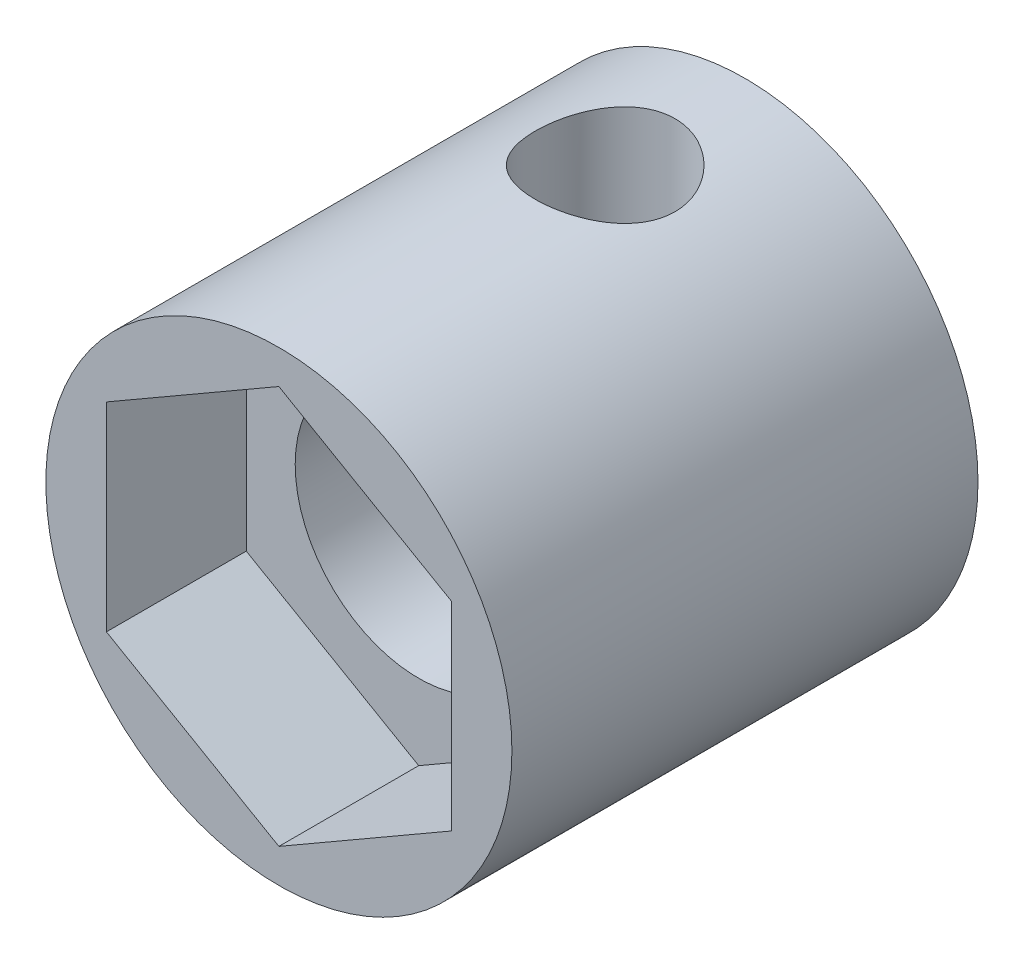
ISO-10303-21;
HEADER;
FILE_DESCRIPTION(('STEP AP214'),'2;1');
FILE_NAME('part.step','',(''),(''),'','','');
FILE_SCHEMA(('AUTOMOTIVE_DESIGN { 1 0 10303 214 1 1 1 1 }'));
ENDSEC;
DATA;
#1=APPLICATION_CONTEXT('core data for automotive mechanical design processes');
#2=APPLICATION_PROTOCOL_DEFINITION('international standard','automotive_design',2000,#1);
#3=PRODUCT_CONTEXT('',#1,'mechanical');
#4=PRODUCT('Part','Part','',(#3));
#5=PRODUCT_RELATED_PRODUCT_CATEGORY('part','',(#4));
#6=PRODUCT_DEFINITION_FORMATION('','',#4);
#7=PRODUCT_DEFINITION_CONTEXT('part definition',#1,'design');
#8=PRODUCT_DEFINITION('design','',#6,#7);
#9=PRODUCT_DEFINITION_SHAPE('','',#8);
#10=(LENGTH_UNIT() NAMED_UNIT(*) SI_UNIT(.MILLI.,.METRE.));
#11=(NAMED_UNIT(*) PLANE_ANGLE_UNIT() SI_UNIT($,.RADIAN.));
#12=(NAMED_UNIT(*) SI_UNIT($,.STERADIAN.) SOLID_ANGLE_UNIT());
#13=UNCERTAINTY_MEASURE_WITH_UNIT(LENGTH_MEASURE(1.E-05),#10,'distance_accuracy_value','');
#14=(GEOMETRIC_REPRESENTATION_CONTEXT(3) GLOBAL_UNCERTAINTY_ASSIGNED_CONTEXT((#13)) GLOBAL_UNIT_ASSIGNED_CONTEXT((#10,
#11,#12)) REPRESENTATION_CONTEXT('',''));
#15=CARTESIAN_POINT('',(0.,0.,0.));
#16=DIRECTION('',(0.,0.,1.));
#17=DIRECTION('',(1.,0.,0.));
#18=AXIS2_PLACEMENT_3D('',#15,#16,#17);
#19=CARTESIAN_POINT('',(0.,0.,10.));
#20=DIRECTION('',(0.,0.,-1.));
#21=DIRECTION('',(-1.,0.,0.));
#22=AXIS2_PLACEMENT_3D('',#19,#20,#21);
#23=CYLINDRICAL_SURFACE('',#22,5.);
#24=CARTESIAN_POINT('',(0.,-5.,4.5));
#25=CARTESIAN_POINT('',(0.0822886127533003,-4.9999992925055,4.49999900251511));
#26=CARTESIAN_POINT('',(0.16458731835153,-4.99794915693954,4.49320613637603));
#27=CARTESIAN_POINT('',(0.326788125304881,-4.98997105593691,4.4662786457779));
#28=CARTESIAN_POINT('',(0.40668950441142,-4.98404193389692,4.44614004197666));
#29=CARTESIAN_POINT('',(0.561732707754527,-4.96895552501836,4.39325398308974));
#30=CARTESIAN_POINT('',(0.636881364395373,-4.95980300250425,4.36052513038106));
#31=CARTESIAN_POINT('',(0.780624181053132,-4.93922109237645,4.28346390694416));
#32=CARTESIAN_POINT('',(0.84921746746967,-4.92779140192067,4.23912999260458));
#33=CARTESIAN_POINT('',(0.979871797183746,-4.90350737192774,4.13877599252733));
#34=CARTESIAN_POINT('',(1.04171807124434,-4.89062383657036,4.08248337411409));
#35=CARTESIAN_POINT('',(1.15524920923324,-4.86505834210442,3.96039077008981));
#36=CARTESIAN_POINT('',(1.20693236327441,-4.85237641724501,3.89458918787504));
#37=CARTESIAN_POINT('',(1.29980037723708,-4.82834113993772,3.75352924696239));
#38=CARTESIAN_POINT('',(1.34072309022214,-4.81702406663875,3.67809153900926));
#39=CARTESIAN_POINT('',(1.4092139477476,-4.79743620394031,3.52101074576971));
#40=CARTESIAN_POINT('',(1.43678529919973,-4.78916468313311,3.43936915607202));
#41=CARTESIAN_POINT('',(1.47701633682652,-4.77690870838434,3.27460973386954));
#42=CARTESIAN_POINT('',(1.49007196234677,-4.77281069324533,3.19159725613606));
#43=CARTESIAN_POINT('',(1.50213730614672,-4.76902789749767,3.02446684378323));
#44=CARTESIAN_POINT('',(1.50115042761078,-4.76934204760571,2.94034918194091));
#45=CARTESIAN_POINT('',(1.48546977199812,-4.77424744067778,2.77661609139151));
#46=CARTESIAN_POINT('',(1.47127205262685,-4.7786838859914,2.69694774963776));
#47=CARTESIAN_POINT('',(1.43037420427056,-4.79108356228624,2.54118021372654));
#48=CARTESIAN_POINT('',(1.40367284141641,-4.79904714132351,2.46508137262567));
#49=CARTESIAN_POINT('',(1.33816026653682,-4.81772733074973,2.31739965033926));
#50=CARTESIAN_POINT('',(1.29918816934642,-4.82848016115952,2.24589291604474));
#51=CARTESIAN_POINT('',(1.21035222588683,-4.85150987000065,2.11026797798981));
#52=CARTESIAN_POINT('',(1.16048574002588,-4.86378711746991,2.04615157058622));
#53=CARTESIAN_POINT('',(1.04881290765546,-4.88911011297937,1.92431380923798));
#54=CARTESIAN_POINT('',(0.986594907466972,-4.90216654310498,1.86697133597033));
#55=CARTESIAN_POINT('',(0.853263259313966,-4.92712244063259,1.76344601593575));
#56=CARTESIAN_POINT('',(0.782149051860887,-4.9390218351841,1.71726387158557));
#57=CARTESIAN_POINT('',(0.632355038342802,-4.9604316006947,1.63714007753527));
#58=CARTESIAN_POINT('',(0.553627749747949,-4.96992543668314,1.60328248375014));
#59=CARTESIAN_POINT('',(0.391245415603518,-4.98533521832222,1.54940040990037));
#60=CARTESIAN_POINT('',(0.307591751589581,-4.99125216186999,1.52937207146751));
#61=CARTESIAN_POINT('',(0.140952242668331,-4.99868364643538,1.50434782210061));
#62=CARTESIAN_POINT('',(0.058050097601186,-5.0003485041779,1.49883841419839));
#63=CARTESIAN_POINT('',(-0.107499605823384,-4.9995292324176,1.50156915571208));
#64=CARTESIAN_POINT('',(-0.190147196690782,-4.99704565677756,1.50980746965144));
#65=CARTESIAN_POINT('',(-0.350903605309698,-4.98830696987163,1.5393846111115));
#66=CARTESIAN_POINT('',(-0.42907277261417,-4.98213829799417,1.56042338758087));
#67=CARTESIAN_POINT('',(-0.580754638954522,-4.96674347841533,1.6146432327782));
#68=CARTESIAN_POINT('',(-0.654266777025584,-4.95751696321085,1.64782576103786));
#69=CARTESIAN_POINT('',(-0.796437189461053,-4.93669654351325,1.72625316548113));
#70=CARTESIAN_POINT('',(-0.86494382619967,-4.92505280829675,1.77175934094797));
#71=CARTESIAN_POINT('',(-0.993523307980148,-4.90073468764318,1.87322475405281));
#72=CARTESIAN_POINT('',(-1.05359403235594,-4.8880600443108,1.92918661188767));
#73=CARTESIAN_POINT('',(-1.16585744551027,-4.86253171869138,2.05238730836935));
#74=CARTESIAN_POINT('',(-1.21768481231504,-4.84968825033268,2.11996187577174));
#75=CARTESIAN_POINT('',(-1.30928995072154,-4.82576515238463,2.26312793901353));
#76=CARTESIAN_POINT('',(-1.34906803829472,-4.81468547654651,2.33871922455822));
#77=CARTESIAN_POINT('',(-1.41517347127168,-4.79567189615055,2.49553249125469));
#78=CARTESIAN_POINT('',(-1.4415634693705,-4.78772337843827,2.57672618653659));
#79=CARTESIAN_POINT('',(-1.48021730815114,-4.77591594362794,2.74268796893148));
#80=CARTESIAN_POINT('',(-1.49248598978779,-4.772055625083,2.82745482078767));
#81=CARTESIAN_POINT('',(-1.50221984485059,-4.76899972496087,2.99436151837623));
#82=CARTESIAN_POINT('',(-1.5002805530849,-4.76961647442755,3.07646365101759));
#83=CARTESIAN_POINT('',(-1.48307505444813,-4.77499401288294,3.2391141033728));
#84=CARTESIAN_POINT('',(-1.46780938124716,-4.77975463592551,3.31966248517635));
#85=CARTESIAN_POINT('',(-1.42476888804136,-4.79275763670386,3.47594539914285));
#86=CARTESIAN_POINT('',(-1.39715175507068,-4.80095604545965,3.55172728736169));
#87=CARTESIAN_POINT('',(-1.33031507121129,-4.81990278909136,3.69764243881772));
#88=CARTESIAN_POINT('',(-1.29109329962876,-4.83065161194312,3.76777461764076));
#89=CARTESIAN_POINT('',(-1.20048763805072,-4.85397676425833,3.90316311652711));
#90=CARTESIAN_POINT('',(-1.14871276092994,-4.86660540163798,3.96814876126041));
#91=CARTESIAN_POINT('',(-1.03517434629782,-4.89201320450026,4.08870249830786));
#92=CARTESIAN_POINT('',(-0.9734082171345,-4.90479240823905,4.14426813946776));
#93=CARTESIAN_POINT('',(-0.839465762183247,-4.92950936570649,4.24602341229503));
#94=CARTESIAN_POINT('',(-0.767037885790607,-4.94141159765674,4.29189144685549));
#95=CARTESIAN_POINT('',(-0.615141373983528,-4.96260680455813,4.37073516990403));
#96=CARTESIAN_POINT('',(-0.535676052998953,-4.97190099931067,4.40371688827451));
#97=CARTESIAN_POINT('',(-0.38075771265528,-4.98602174969301,4.45289527565275));
#98=CARTESIAN_POINT('',(-0.305786961954233,-4.99122027381068,4.47051167288325));
#99=CARTESIAN_POINT('',(-0.153880195230779,-4.99820944494492,4.49406352524158));
#100=CARTESIAN_POINT('',(-0.0769445098581392,-5.0000006615474,4.50000093270482));
#101=CARTESIAN_POINT('',(0.,-5.,4.5));
#102=B_SPLINE_CURVE_WITH_KNOTS('',3,(#24,#25,#26,#27,#28,#29,#30,#31,#32,#33,#34,#35,#36,#37,
#38,#39,#40,#41,#42,#43,#44,#45,#46,#47,#48,#49,#50,#51,#52,#53,#54,#55,#56,#57,#58,#59,#60,#61,
#62,#63,#64,#65,#66,#67,#68,#69,#70,#71,#72,#73,#74,#75,#76,#77,#78,#79,#80,#81,#82,#83,#84,#85,
#86,#87,#88,#89,#90,#91,#92,#93,#94,#95,#96,#97,#98,#99,#100,#101),.UNSPECIFIED.,.T.,.F.,(4,2,2,
2,2,2,2,2,2,2,2,2,2,2,2,2,2,2,2,2,2,2,2,2,2,2,2,2,2,2,2,2,2,2,2,2,2,2,4),(0.,0.246583203612611,
0.493239964846,0.739533676300874,0.985860164412702,1.23855602948192,1.49129437288633,
1.74971481004109,2.00807314543224,2.25919689356599,2.51025978319089,2.75226016697676,
2.99428443658001,3.2396242644712,3.48502360158555,3.74067104048167,3.99633456531071,
4.25371046881689,4.51101453528808,4.75908809438545,5.00712853550327,5.24956746682327,
5.49203554593729,5.74011305702908,5.98825282000191,6.24540400322818,6.5025484425268,
6.75847814951252,7.01432009460283,7.25950155466943,7.504673196616,7.74680040402721,
7.98897397553107,8.23996925679931,8.49102974897502,8.7494299615667,9.00770911595235,
9.23831691930459,9.46888616948874),.UNSPECIFIED.);
#103=CARTESIAN_POINT('',(0.,-5.,4.5));
#104=VERTEX_POINT('',#103);
#105=EDGE_CURVE('E199',#104,#104,#102,.T.);
#106=ORIENTED_EDGE('',*,*,#105,.T.);
#107=EDGE_LOOP('',(#106));
#108=FACE_BOUND('',#107,.T.);
#109=CARTESIAN_POINT('',(0.,5.,4.5));
#110=CARTESIAN_POINT('',(-0.0822886127532999,4.9999992925055,4.49999900251511));
#111=CARTESIAN_POINT('',(-0.164587318351529,4.99794915693954,4.49320613637603));
#112=CARTESIAN_POINT('',(-0.32678812530488,4.98997105593691,4.4662786457779));
#113=CARTESIAN_POINT('',(-0.406689504411419,4.98404193389692,4.44614004197666));
#114=CARTESIAN_POINT('',(-0.561732707754526,4.96895552501836,4.39325398308974));
#115=CARTESIAN_POINT('',(-0.636881364395372,4.95980300250425,4.36052513038106));
#116=CARTESIAN_POINT('',(-0.780624181053131,4.93922109237645,4.28346390694416));
#117=CARTESIAN_POINT('',(-0.849217467469668,4.92779140192067,4.23912999260458));
#118=CARTESIAN_POINT('',(-0.979871797183744,4.90350737192774,4.13877599252733));
#119=CARTESIAN_POINT('',(-1.04171807124434,4.89062383657036,4.08248337411409));
#120=CARTESIAN_POINT('',(-1.15524920923324,4.86505834210442,3.96039077008982));
#121=CARTESIAN_POINT('',(-1.20693236327441,4.85237641724501,3.89458918787504));
#122=CARTESIAN_POINT('',(-1.29980037723708,4.82834113993772,3.75352924696239));
#123=CARTESIAN_POINT('',(-1.34072309022213,4.81702406663875,3.67809153900926));
#124=CARTESIAN_POINT('',(-1.4092139477476,4.79743620394031,3.52101074576971));
#125=CARTESIAN_POINT('',(-1.43678529919973,4.78916468313311,3.43936915607202));
#126=CARTESIAN_POINT('',(-1.47701633682652,4.77690870838434,3.27460973386954));
#127=CARTESIAN_POINT('',(-1.49007196234677,4.77281069324533,3.19159725613606));
#128=CARTESIAN_POINT('',(-1.50213730614672,4.76902789749767,3.02446684378323));
#129=CARTESIAN_POINT('',(-1.50115042761078,4.76934204760571,2.94034918194091));
#130=CARTESIAN_POINT('',(-1.48546977199812,4.77424744067778,2.77661609139152));
#131=CARTESIAN_POINT('',(-1.47127205262685,4.77868388599141,2.69694774963776));
#132=CARTESIAN_POINT('',(-1.43037420427056,4.79108356228624,2.54118021372654));
#133=CARTESIAN_POINT('',(-1.40367284141641,4.79904714132351,2.46508137262567));
#134=CARTESIAN_POINT('',(-1.33816026653682,4.81772733074973,2.31739965033926));
#135=CARTESIAN_POINT('',(-1.29918816934642,4.82848016115952,2.24589291604474));
#136=CARTESIAN_POINT('',(-1.21035222588683,4.85150987000065,2.11026797798981));
#137=CARTESIAN_POINT('',(-1.16048574002588,4.86378711746991,2.04615157058622));
#138=CARTESIAN_POINT('',(-1.04881290765546,4.88911011297937,1.92431380923798));
#139=CARTESIAN_POINT('',(-0.986594907466971,4.90216654310498,1.86697133597033));
#140=CARTESIAN_POINT('',(-0.853263259313966,4.92712244063259,1.76344601593575));
#141=CARTESIAN_POINT('',(-0.782149051860887,4.9390218351841,1.71726387158557));
#142=CARTESIAN_POINT('',(-0.632355038342803,4.9604316006947,1.63714007753527));
#143=CARTESIAN_POINT('',(-0.55362774974795,4.96992543668314,1.60328248375014));
#144=CARTESIAN_POINT('',(-0.391245415603519,4.98533521832222,1.54940040990037));
#145=CARTESIAN_POINT('',(-0.307591751589582,4.99125216186999,1.52937207146751));
#146=CARTESIAN_POINT('',(-0.140952242668332,4.99868364643538,1.50434782210061));
#147=CARTESIAN_POINT('',(-0.0580500976011871,5.0003485041779,1.49883841419839));
#148=CARTESIAN_POINT('',(0.107499605823383,4.9995292324176,1.50156915571208));
#149=CARTESIAN_POINT('',(0.190147196690781,4.99704565677756,1.50980746965144));
#150=CARTESIAN_POINT('',(0.350903605309697,4.98830696987163,1.5393846111115));
#151=CARTESIAN_POINT('',(0.429072772614169,4.98213829799417,1.56042338758087));
#152=CARTESIAN_POINT('',(0.580754638954522,4.96674347841533,1.6146432327782));
#153=CARTESIAN_POINT('',(0.654266777025584,4.95751696321085,1.64782576103786));
#154=CARTESIAN_POINT('',(0.796437189461053,4.93669654351325,1.72625316548113));
#155=CARTESIAN_POINT('',(0.86494382619967,4.92505280829675,1.77175934094797));
#156=CARTESIAN_POINT('',(0.993523307980147,4.90073468764318,1.87322475405281));
#157=CARTESIAN_POINT('',(1.05359403235593,4.8880600443108,1.92918661188767));
#158=CARTESIAN_POINT('',(1.16585744551027,4.86253171869138,2.05238730836935));
#159=CARTESIAN_POINT('',(1.21768481231504,4.84968825033268,2.11996187577174));
#160=CARTESIAN_POINT('',(1.30928995072154,4.82576515238463,2.26312793901353));
#161=CARTESIAN_POINT('',(1.34906803829472,4.81468547654651,2.33871922455821));
#162=CARTESIAN_POINT('',(1.41517347127168,4.79567189615055,2.49553249125469));
#163=CARTESIAN_POINT('',(1.4415634693705,4.78772337843827,2.57672618653659));
#164=CARTESIAN_POINT('',(1.48021730815114,4.77591594362794,2.74268796893148));
#165=CARTESIAN_POINT('',(1.49248598978779,4.772055625083,2.82745482078767));
#166=CARTESIAN_POINT('',(1.50221984485059,4.76899972496087,2.99436151837623));
#167=CARTESIAN_POINT('',(1.5002805530849,4.76961647442754,3.07646365101759));
#168=CARTESIAN_POINT('',(1.48307505444813,4.77499401288294,3.2391141033728));
#169=CARTESIAN_POINT('',(1.46780938124716,4.77975463592551,3.31966248517635));
#170=CARTESIAN_POINT('',(1.42476888804136,4.79275763670385,3.47594539914285));
#171=CARTESIAN_POINT('',(1.39715175507068,4.80095604545965,3.55172728736169));
#172=CARTESIAN_POINT('',(1.33031507121129,4.81990278909136,3.69764243881772));
#173=CARTESIAN_POINT('',(1.29109329962876,4.83065161194312,3.76777461764076));
#174=CARTESIAN_POINT('',(1.20048763805072,4.85397676425833,3.90316311652711));
#175=CARTESIAN_POINT('',(1.14871276092994,4.86660540163798,3.96814876126041));
#176=CARTESIAN_POINT('',(1.03517434629782,4.89201320450026,4.08870249830786));
#177=CARTESIAN_POINT('',(0.973408217134502,4.90479240823905,4.14426813946776));
#178=CARTESIAN_POINT('',(0.839465762183249,4.92950936570649,4.24602341229503));
#179=CARTESIAN_POINT('',(0.767037885790608,4.94141159765674,4.29189144685549));
#180=CARTESIAN_POINT('',(0.61514137398353,4.96260680455813,4.37073516990402));
#181=CARTESIAN_POINT('',(0.535676052998956,4.97190099931067,4.40371688827451));
#182=CARTESIAN_POINT('',(0.380757712655282,4.98602174969301,4.45289527565275));
#183=CARTESIAN_POINT('',(0.305786961954235,4.99122027381068,4.47051167288325));
#184=CARTESIAN_POINT('',(0.15388019523078,4.99820944494492,4.49406352524158));
#185=CARTESIAN_POINT('',(0.0769445098581397,5.0000006615474,4.50000093270482));
#186=CARTESIAN_POINT('',(0.,5.,4.5));
#187=B_SPLINE_CURVE_WITH_KNOTS('',3,(#109,#110,#111,#112,#113,#114,#115,#116,#117,#118,#119,
#120,#121,#122,#123,#124,#125,#126,#127,#128,#129,#130,#131,#132,#133,#134,#135,#136,#137,#138,
#139,#140,#141,#142,#143,#144,#145,#146,#147,#148,#149,#150,#151,#152,#153,#154,#155,#156,#157,
#158,#159,#160,#161,#162,#163,#164,#165,#166,#167,#168,#169,#170,#171,#172,#173,#174,#175,#176,
#177,#178,#179,#180,#181,#182,#183,#184,#185,#186),.UNSPECIFIED.,.T.,.F.,(4,2,2,2,2,2,2,2,2,2,2,
2,2,2,2,2,2,2,2,2,2,2,2,2,2,2,2,2,2,2,2,2,2,2,2,2,2,2,4),(0.,0.24658320361261,0.493239964845999,
0.739533676300873,0.985860164412701,1.23855602948191,1.49129437288633,1.74971481004109,
2.00807314543223,2.25919689356599,2.51025978319089,2.75226016697676,2.99428443658001,
3.23962426447119,3.48502360158555,3.74067104048167,3.99633456531071,4.25371046881688,
4.51101453528807,4.75908809438545,5.00712853550327,5.24956746682327,5.49203554593728,
5.74011305702908,5.98825282000191,6.24540400322818,6.5025484425268,6.75847814951251,
7.01432009460283,7.25950155466942,7.50467319661599,7.74680040402721,7.98897397553107,
8.2399692567993,8.49102974897502,8.7494299615667,9.00770911595235,9.23831691930459,
9.46888616948874),.UNSPECIFIED.);
#188=CARTESIAN_POINT('',(0.,5.,4.5));
#189=VERTEX_POINT('',#188);
#190=EDGE_CURVE('E193',#189,#189,#187,.T.);
#191=ORIENTED_EDGE('',*,*,#190,.T.);
#192=EDGE_LOOP('',(#191));
#193=FACE_BOUND('',#192,.T.);
#194=CARTESIAN_POINT('',(0.,0.,10.));
#195=DIRECTION('',(0.,0.,1.));
#196=DIRECTION('',(1.,0.,0.));
#197=AXIS2_PLACEMENT_3D('',#194,#195,#196);
#198=CIRCLE('',#197,5.);
#199=CARTESIAN_POINT('',(5.,0.,10.));
#200=VERTEX_POINT('',#199);
#201=EDGE_CURVE('E11',#200,#200,#198,.T.);
#202=ORIENTED_EDGE('',*,*,#201,.F.);
#203=EDGE_LOOP('',(#202));
#204=FACE_BOUND('',#203,.T.);
#205=CARTESIAN_POINT('',(0.,0.,0.));
#206=DIRECTION('',(0.,0.,1.));
#207=DIRECTION('',(1.,0.,0.));
#208=AXIS2_PLACEMENT_3D('',#205,#206,#207);
#209=CIRCLE('',#208,5.);
#210=CARTESIAN_POINT('',(5.,0.,0.));
#211=VERTEX_POINT('',#210);
#212=EDGE_CURVE('E48',#211,#211,#209,.T.);
#213=ORIENTED_EDGE('',*,*,#212,.T.);
#214=EDGE_LOOP('',(#213));
#215=FACE_BOUND('',#214,.T.);
#216=ADVANCED_FACE('F38',(#108,#193,#204,#215),#23,.T.);
#217=CARTESIAN_POINT('',(0.,0.,10.));
#218=DIRECTION('',(0.,0.,1.));
#219=DIRECTION('',(1.,0.,0.));
#220=AXIS2_PLACEMENT_3D('',#217,#218,#219);
#221=PLANE('',#220);
#222=DIRECTION('',(0.866025403784439,0.5,0.));
#223=VECTOR('',#222,1.);
#224=CARTESIAN_POINT('',(0.,-4.27239199200323,10.));
#225=LINE('',#224,#223);
#226=CARTESIAN_POINT('',(0.,-4.27239199200323,10.));
#227=VERTEX_POINT('',#226);
#228=CARTESIAN_POINT('',(3.7,-2.13619599600162,10.));
#229=VERTEX_POINT('',#228);
#230=EDGE_CURVE('E56',#227,#229,#225,.T.);
#231=ORIENTED_EDGE('',*,*,#230,.F.);
#232=DIRECTION('',(0.866025403784439,-0.5,0.));
#233=VECTOR('',#232,1.);
#234=CARTESIAN_POINT('',(-3.7,-2.13619599600162,10.));
#235=LINE('',#234,#233);
#236=CARTESIAN_POINT('',(-3.7,-2.13619599600162,10.));
#237=VERTEX_POINT('',#236);
#238=EDGE_CURVE('E150',#237,#227,#235,.T.);
#239=ORIENTED_EDGE('',*,*,#238,.F.);
#240=DIRECTION('',(0.,-1.,0.));
#241=VECTOR('',#240,1.);
#242=CARTESIAN_POINT('',(-3.7,2.13619599600161,10.));
#243=LINE('',#242,#241);
#244=CARTESIAN_POINT('',(-3.7,2.13619599600161,10.));
#245=VERTEX_POINT('',#244);
#246=EDGE_CURVE('E147',#245,#237,#243,.T.);
#247=ORIENTED_EDGE('',*,*,#246,.F.);
#248=DIRECTION('',(-0.866025403784439,-0.5,0.));
#249=VECTOR('',#248,1.);
#250=CARTESIAN_POINT('',(0.,4.27239199200323,10.));
#251=LINE('',#250,#249);
#252=CARTESIAN_POINT('',(0.,4.27239199200323,10.));
#253=VERTEX_POINT('',#252);
#254=EDGE_CURVE('E104',#253,#245,#251,.T.);
#255=ORIENTED_EDGE('',*,*,#254,.F.);
#256=DIRECTION('',(-0.866025403784439,0.5,0.));
#257=VECTOR('',#256,1.);
#258=CARTESIAN_POINT('',(3.7,2.13619599600161,10.));
#259=LINE('',#258,#257);
#260=CARTESIAN_POINT('',(3.7,2.13619599600161,10.));
#261=VERTEX_POINT('',#260);
#262=EDGE_CURVE('E141',#261,#253,#259,.T.);
#263=ORIENTED_EDGE('',*,*,#262,.F.);
#264=DIRECTION('',(0.,1.,0.));
#265=VECTOR('',#264,1.);
#266=CARTESIAN_POINT('',(3.7,-2.13619599600162,10.));
#267=LINE('',#266,#265);
#268=EDGE_CURVE('E136',#229,#261,#267,.T.);
#269=ORIENTED_EDGE('',*,*,#268,.F.);
#270=EDGE_LOOP('',(#231,#239,#247,#255,#263,#269));
#271=FACE_BOUND('',#270,.T.);
#272=ORIENTED_EDGE('',*,*,#201,.T.);
#273=EDGE_LOOP('',(#272));
#274=FACE_BOUND('',#273,.T.);
#275=ADVANCED_FACE('F218',(#271,#274),#221,.T.);
#276=CARTESIAN_POINT('',(0.,0.,0.));
#277=DIRECTION('',(0.,0.,1.));
#278=DIRECTION('',(1.,0.,0.));
#279=AXIS2_PLACEMENT_3D('',#276,#277,#278);
#280=PLANE('',#279);
#281=CARTESIAN_POINT('',(0.,0.,0.));
#282=DIRECTION('',(0.,0.,-1.));
#283=DIRECTION('',(-1.,0.,0.));
#284=AXIS2_PLACEMENT_3D('',#281,#282,#283);
#285=CIRCLE('',#284,2.65);
#286=CARTESIAN_POINT('',(-2.65,0.,0.));
#287=VERTEX_POINT('',#286);
#288=EDGE_CURVE('E137',#287,#287,#285,.T.);
#289=ORIENTED_EDGE('',*,*,#288,.F.);
#290=EDGE_LOOP('',(#289));
#291=FACE_BOUND('',#290,.T.);
#292=ORIENTED_EDGE('',*,*,#212,.F.);
#293=EDGE_LOOP('',(#292));
#294=FACE_BOUND('',#293,.T.);
#295=ADVANCED_FACE('F230',(#291,#294),#280,.F.);
#296=CARTESIAN_POINT('',(0.,-4.27239199200323,7.));
#297=DIRECTION('',(0.5,-0.866025403784439,0.));
#298=DIRECTION('',(0.866025403784439,0.5,0.));
#299=AXIS2_PLACEMENT_3D('',#296,#297,#298);
#300=PLANE('',#299);
#301=ORIENTED_EDGE('',*,*,#230,.T.);
#302=DIRECTION('',(0.,0.,1.));
#303=VECTOR('',#302,1.);
#304=CARTESIAN_POINT('',(3.7,-2.13619599600162,7.));
#305=LINE('',#304,#303);
#306=CARTESIAN_POINT('',(3.7,-2.13619599600162,7.));
#307=VERTEX_POINT('',#306);
#308=EDGE_CURVE('E86',#307,#229,#305,.T.);
#309=ORIENTED_EDGE('',*,*,#308,.F.);
#310=DIRECTION('',(0.866025403784439,0.5,0.));
#311=VECTOR('',#310,1.);
#312=CARTESIAN_POINT('',(0.,-4.27239199200323,7.));
#313=LINE('',#312,#311);
#314=CARTESIAN_POINT('',(0.,-4.27239199200323,7.));
#315=VERTEX_POINT('',#314);
#316=EDGE_CURVE('E153',#315,#307,#313,.T.);
#317=ORIENTED_EDGE('',*,*,#316,.F.);
#318=DIRECTION('',(0.,0.,1.));
#319=VECTOR('',#318,1.);
#320=CARTESIAN_POINT('',(0.,-4.27239199200323,7.));
#321=LINE('',#320,#319);
#322=EDGE_CURVE('E64',#315,#227,#321,.T.);
#323=ORIENTED_EDGE('',*,*,#322,.T.);
#324=EDGE_LOOP('',(#301,#309,#317,#323));
#325=FACE_BOUND('',#324,.T.);
#326=ADVANCED_FACE('F223',(#325),#300,.F.);
#327=CARTESIAN_POINT('',(-3.7,-2.13619599600162,7.));
#328=DIRECTION('',(-0.5,-0.866025403784439,0.));
#329=DIRECTION('',(0.866025403784439,-0.5,0.));
#330=AXIS2_PLACEMENT_3D('',#327,#328,#329);
#331=PLANE('',#330);
#332=ORIENTED_EDGE('',*,*,#238,.T.);
#333=ORIENTED_EDGE('',*,*,#322,.F.);
#334=DIRECTION('',(0.866025403784439,-0.5,0.));
#335=VECTOR('',#334,1.);
#336=CARTESIAN_POINT('',(-3.7,-2.13619599600162,7.));
#337=LINE('',#336,#335);
#338=CARTESIAN_POINT('',(-3.7,-2.13619599600162,7.));
#339=VERTEX_POINT('',#338);
#340=EDGE_CURVE('E118',#339,#315,#337,.T.);
#341=ORIENTED_EDGE('',*,*,#340,.F.);
#342=DIRECTION('',(0.,0.,1.));
#343=VECTOR('',#342,1.);
#344=CARTESIAN_POINT('',(-3.7,-2.13619599600162,7.));
#345=LINE('',#344,#343);
#346=EDGE_CURVE('E109',#339,#237,#345,.T.);
#347=ORIENTED_EDGE('',*,*,#346,.T.);
#348=EDGE_LOOP('',(#332,#333,#341,#347));
#349=FACE_BOUND('',#348,.T.);
#350=ADVANCED_FACE('F221',(#349),#331,.F.);
#351=CARTESIAN_POINT('',(-3.7,2.13619599600161,7.));
#352=DIRECTION('',(-1.,0.,0.));
#353=DIRECTION('',(0.,0.,1.));
#354=AXIS2_PLACEMENT_3D('',#351,#352,#353);
#355=PLANE('',#354);
#356=ORIENTED_EDGE('',*,*,#246,.T.);
#357=ORIENTED_EDGE('',*,*,#346,.F.);
#358=DIRECTION('',(0.,-1.,0.));
#359=VECTOR('',#358,1.);
#360=CARTESIAN_POINT('',(-3.7,2.13619599600161,7.));
#361=LINE('',#360,#359);
#362=CARTESIAN_POINT('',(-3.7,2.13619599600161,7.));
#363=VERTEX_POINT('',#362);
#364=EDGE_CURVE('E113',#363,#339,#361,.T.);
#365=ORIENTED_EDGE('',*,*,#364,.F.);
#366=DIRECTION('',(0.,0.,1.));
#367=VECTOR('',#366,1.);
#368=CARTESIAN_POINT('',(-3.7,2.13619599600161,7.));
#369=LINE('',#368,#367);
#370=EDGE_CURVE('E97',#363,#245,#369,.T.);
#371=ORIENTED_EDGE('',*,*,#370,.T.);
#372=EDGE_LOOP('',(#356,#357,#365,#371));
#373=FACE_BOUND('',#372,.T.);
#374=ADVANCED_FACE('F114',(#373),#355,.F.);
#375=CARTESIAN_POINT('',(0.,4.27239199200323,7.));
#376=DIRECTION('',(-0.5,0.866025403784439,0.));
#377=DIRECTION('',(-0.866025403784439,-0.5,0.));
#378=AXIS2_PLACEMENT_3D('',#375,#376,#377);
#379=PLANE('',#378);
#380=ORIENTED_EDGE('',*,*,#254,.T.);
#381=ORIENTED_EDGE('',*,*,#370,.F.);
#382=DIRECTION('',(-0.866025403784439,-0.5,0.));
#383=VECTOR('',#382,1.);
#384=CARTESIAN_POINT('',(0.,4.27239199200323,7.));
#385=LINE('',#384,#383);
#386=CARTESIAN_POINT('',(0.,4.27239199200323,7.));
#387=VERTEX_POINT('',#386);
#388=EDGE_CURVE('E101',#387,#363,#385,.T.);
#389=ORIENTED_EDGE('',*,*,#388,.F.);
#390=DIRECTION('',(0.,0.,1.));
#391=VECTOR('',#390,1.);
#392=CARTESIAN_POINT('',(0.,4.27239199200323,7.));
#393=LINE('',#392,#391);
#394=EDGE_CURVE('E110',#387,#253,#393,.T.);
#395=ORIENTED_EDGE('',*,*,#394,.T.);
#396=EDGE_LOOP('',(#380,#381,#389,#395));
#397=FACE_BOUND('',#396,.T.);
#398=ADVANCED_FACE('F99',(#397),#379,.F.);
#399=CARTESIAN_POINT('',(3.7,2.13619599600161,7.));
#400=DIRECTION('',(0.5,0.866025403784439,0.));
#401=DIRECTION('',(-0.866025403784439,0.5,0.));
#402=AXIS2_PLACEMENT_3D('',#399,#400,#401);
#403=PLANE('',#402);
#404=ORIENTED_EDGE('',*,*,#262,.T.);
#405=ORIENTED_EDGE('',*,*,#394,.F.);
#406=DIRECTION('',(-0.866025403784439,0.5,0.));
#407=VECTOR('',#406,1.);
#408=CARTESIAN_POINT('',(3.7,2.13619599600161,7.));
#409=LINE('',#408,#407);
#410=CARTESIAN_POINT('',(3.7,2.13619599600161,7.));
#411=VERTEX_POINT('',#410);
#412=EDGE_CURVE('E124',#411,#387,#409,.T.);
#413=ORIENTED_EDGE('',*,*,#412,.F.);
#414=DIRECTION('',(0.,0.,1.));
#415=VECTOR('',#414,1.);
#416=CARTESIAN_POINT('',(3.7,2.13619599600161,7.));
#417=LINE('',#416,#415);
#418=EDGE_CURVE('E160',#411,#261,#417,.T.);
#419=ORIENTED_EDGE('',*,*,#418,.T.);
#420=EDGE_LOOP('',(#404,#405,#413,#419));
#421=FACE_BOUND('',#420,.T.);
#422=ADVANCED_FACE('F216',(#421),#403,.F.);
#423=CARTESIAN_POINT('',(3.7,-2.13619599600162,7.));
#424=DIRECTION('',(1.,0.,0.));
#425=DIRECTION('',(0.,0.,-1.));
#426=AXIS2_PLACEMENT_3D('',#423,#424,#425);
#427=PLANE('',#426);
#428=ORIENTED_EDGE('',*,*,#268,.T.);
#429=ORIENTED_EDGE('',*,*,#418,.F.);
#430=DIRECTION('',(0.,1.,0.));
#431=VECTOR('',#430,1.);
#432=CARTESIAN_POINT('',(3.7,-2.13619599600162,7.));
#433=LINE('',#432,#431);
#434=EDGE_CURVE('E128',#307,#411,#433,.T.);
#435=ORIENTED_EDGE('',*,*,#434,.F.);
#436=ORIENTED_EDGE('',*,*,#308,.T.);
#437=EDGE_LOOP('',(#428,#429,#435,#436));
#438=FACE_BOUND('',#437,.T.);
#439=ADVANCED_FACE('F212',(#438),#427,.F.);
#440=CARTESIAN_POINT('',(0.,0.,7.));
#441=DIRECTION('',(0.,0.,1.));
#442=DIRECTION('',(1.,0.,0.));
#443=AXIS2_PLACEMENT_3D('',#440,#441,#442);
#444=PLANE('',#443);
#445=CARTESIAN_POINT('',(0.,0.,7.));
#446=DIRECTION('',(0.,0.,1.));
#447=DIRECTION('',(1.,0.,0.));
#448=AXIS2_PLACEMENT_3D('',#445,#446,#447);
#449=CIRCLE('',#448,2.65);
#450=CARTESIAN_POINT('',(2.65,0.,7.));
#451=VERTEX_POINT('',#450);
#452=EDGE_CURVE('E42',#451,#451,#449,.T.);
#453=ORIENTED_EDGE('',*,*,#452,.F.);
#454=EDGE_LOOP('',(#453));
#455=FACE_BOUND('',#454,.T.);
#456=ORIENTED_EDGE('',*,*,#316,.T.);
#457=ORIENTED_EDGE('',*,*,#434,.T.);
#458=ORIENTED_EDGE('',*,*,#412,.T.);
#459=ORIENTED_EDGE('',*,*,#388,.T.);
#460=ORIENTED_EDGE('',*,*,#364,.T.);
#461=ORIENTED_EDGE('',*,*,#340,.T.);
#462=EDGE_LOOP('',(#456,#457,#458,#459,#460,#461));
#463=FACE_BOUND('',#462,.T.);
#464=ADVANCED_FACE('F121',(#455,#463),#444,.T.);
#465=CARTESIAN_POINT('',(0.,0.,6.));
#466=DIRECTION('',(0.,0.,-1.));
#467=DIRECTION('',(-1.,0.,0.));
#468=AXIS2_PLACEMENT_3D('',#465,#466,#467);
#469=CYLINDRICAL_SURFACE('',#468,2.65);
#470=CARTESIAN_POINT('',(0.,-2.65,4.5));
#471=CARTESIAN_POINT('',(-0.0776451351454821,-2.65000392335561,4.50000445616459));
#472=CARTESIAN_POINT('',(-0.155265243129478,-2.6465595998598,4.49394609079311));
#473=CARTESIAN_POINT('',(-0.3080810086431,-2.63314780218255,4.47005631321782));
#474=CARTESIAN_POINT('',(-0.383276546166906,-2.62318000563567,4.45222431920528));
#475=CARTESIAN_POINT('',(-0.528896574231053,-2.59773372721452,4.40573653220259));
#476=CARTESIAN_POINT('',(-0.599337594867206,-2.58227564769634,4.37712078882913));
#477=CARTESIAN_POINT('',(-0.734278089089511,-2.54719500836197,4.31015835750319));
#478=CARTESIAN_POINT('',(-0.798776076366276,-2.52757141081212,4.27180924426055));
#479=CARTESIAN_POINT('',(-0.925145734432687,-2.48422614009339,4.18341416344298));
#480=CARTESIAN_POINT('',(-0.986503715088788,-2.46031219465887,4.13272993216486));
#481=CARTESIAN_POINT('',(-1.10034320112002,-2.41155294861164,4.02251250505507));
#482=CARTESIAN_POINT('',(-1.152815194255,-2.38670668428515,3.96296995304427));
#483=CARTESIAN_POINT('',(-1.25302589580479,-2.33578842282798,3.82923538121635));
#484=CARTESIAN_POINT('',(-1.29967034363897,-2.30986642473796,3.75415916233435));
#485=CARTESIAN_POINT('',(-1.37947373268529,-2.26311804671517,3.59572494193616));
#486=CARTESIAN_POINT('',(-1.41265265314321,-2.24228413584786,3.51237944019529));
#487=CARTESIAN_POINT('',(-1.45827525033418,-2.21280459756456,3.3583421400138));
#488=CARTESIAN_POINT('',(-1.4736590801642,-2.202493687969,3.28884020502708));
#489=CARTESIAN_POINT('',(-1.49440533532424,-2.1884735870522,3.14773012085772));
#490=CARTESIAN_POINT('',(-1.49977818834805,-2.18475752655671,3.07612424228473));
#491=CARTESIAN_POINT('',(-1.50020860583597,-2.18446199582159,2.9327777633035));
#492=CARTESIAN_POINT('',(-1.49525307906938,-2.18789158269466,2.86103710721035));
#493=CARTESIAN_POINT('',(-1.47529122470204,-2.20139839758785,2.71959843515659));
#494=CARTESIAN_POINT('',(-1.46027812013105,-2.21148010785493,2.64990182958657));
#495=CARTESIAN_POINT('',(-1.42098096442973,-2.23692928486277,2.51442712861242));
#496=CARTESIAN_POINT('',(-1.39671929509813,-2.25228398199633,2.4486400129564));
#497=CARTESIAN_POINT('',(-1.33976257864295,-2.28662193870185,2.32186132528258));
#498=CARTESIAN_POINT('',(-1.30706427728561,-2.30560659771351,2.26087161562383));
#499=CARTESIAN_POINT('',(-1.22820898705445,-2.34868509447826,2.13522482411745));
#500=CARTESIAN_POINT('',(-1.18074355154379,-2.37311273769192,2.07150219952729));
#501=CARTESIAN_POINT('',(-1.07641299072639,-2.42222294984682,1.95232868996513));
#502=CARTESIAN_POINT('',(-1.01954005354446,-2.44690571453283,1.89688475293434));
#503=CARTESIAN_POINT('',(-0.890533364339751,-2.4969459851787,1.78974236420858));
#504=CARTESIAN_POINT('',(-0.817410432227788,-2.52208135261908,1.73911906547338));
#505=CARTESIAN_POINT('',(-0.662144443087243,-2.56721303771464,1.6511074979702));
#506=CARTESIAN_POINT('',(-0.580007216717488,-2.5872126496589,1.61371073930598));
#507=CARTESIAN_POINT('',(-0.414962378877204,-2.61856037299321,1.55608150230661));
#508=CARTESIAN_POINT('',(-0.33250920321141,-2.63041515335286,1.53483268048695));
#509=CARTESIAN_POINT('',(-0.164480402261993,-2.64623163960658,1.50662014817671));
#510=CARTESIAN_POINT('',(-0.078907822181815,-2.65020084393257,1.49964286662342));
#511=CARTESIAN_POINT('',(0.0819584246854248,-2.64980753363073,1.50034205932854));
#512=CARTESIAN_POINT('',(0.157267870116892,-2.6463770645567,1.50637920755649));
#513=CARTESIAN_POINT('',(0.305604032355126,-2.63337194483695,1.52954427487749));
#514=CARTESIAN_POINT('',(0.37863069728929,-2.62379715467745,1.54667244580484));
#515=CARTESIAN_POINT('',(0.519934148784154,-2.59947590146879,1.59105896554533));
#516=CARTESIAN_POINT('',(0.588243980637094,-2.58477100896598,1.61823598882585));
#517=CARTESIAN_POINT('',(0.71939071472643,-2.55138431451472,1.68174706566655));
#518=CARTESIAN_POINT('',(0.782226244575526,-2.53270151934047,1.71808340659569));
#519=CARTESIAN_POINT('',(0.907663230064705,-2.49067543229227,1.80314072461456));
#520=CARTESIAN_POINT('',(0.969562821580555,-2.46704964519187,1.85275592347742));
#521=CARTESIAN_POINT('',(1.08463785324289,-2.41867032353198,1.96086359599015));
#522=CARTESIAN_POINT('',(1.13780328118757,-2.3939155357132,2.01936611163477));
#523=CARTESIAN_POINT('',(1.23973034338604,-2.34289426396824,2.15104191389155));
#524=CARTESIAN_POINT('',(1.28739829519277,-2.31675276230857,2.22511700700882));
#525=CARTESIAN_POINT('',(1.36946305692568,-2.26921362691913,2.38165371566673));
#526=CARTESIAN_POINT('',(1.40387795547624,-2.24780954435424,2.46410370484427));
#527=CARTESIAN_POINT('',(1.45206499790085,-2.2169003214795,2.6172281786489));
#528=CARTESIAN_POINT('',(1.46866589800445,-2.20583494736462,2.68669636386509));
#529=CARTESIAN_POINT('',(1.49181698218517,-2.1902475245301,2.82797782613719));
#530=CARTESIAN_POINT('',(1.49837812836199,-2.18571833945387,2.89978845789046));
#531=CARTESIAN_POINT('',(1.50109196049382,-2.18385591779794,3.04382712426755));
#532=CARTESIAN_POINT('',(1.49722656450553,-2.18653518225238,3.11605566697585));
#533=CARTESIAN_POINT('',(1.479280000376,-2.19871380288595,3.25865579163495));
#534=CARTESIAN_POINT('',(1.46519231790622,-2.20821750801761,3.32902615978069));
#535=CARTESIAN_POINT('',(1.42774604072315,-2.23260537929607,3.46527117744463));
#536=CARTESIAN_POINT('',(1.40450284087821,-2.24742237666864,3.53119025653175));
#537=CARTESIAN_POINT('',(1.34957613941173,-2.2808277238179,3.65836805422646));
#538=CARTESIAN_POINT('',(1.31788946015411,-2.29941749281791,3.71962500709862));
#539=CARTESIAN_POINT('',(1.24136798471473,-2.34172877890297,3.84572204728124));
#540=CARTESIAN_POINT('',(1.19526281804394,-2.36580021059562,3.90967435707476));
#541=CARTESIAN_POINT('',(1.0937243105064,-2.41442341765651,4.02953629045693));
#542=CARTESIAN_POINT('',(1.03828333663758,-2.43897557143085,4.08543926292022));
#543=CARTESIAN_POINT('',(0.911878431576568,-2.48920098481474,4.19424341439003));
#544=CARTESIAN_POINT('',(0.839856452318042,-2.51466786795749,4.24602308249204));
#545=CARTESIAN_POINT('',(0.686629476509777,-2.5607474568879,4.33658039426847));
#546=CARTESIAN_POINT('',(0.605428223673222,-2.58136213112329,4.3753633131889));
#547=CARTESIAN_POINT('',(0.438486857734336,-2.61481418170605,4.43715314053798));
#548=CARTESIAN_POINT('',(0.352950645041878,-2.62786258293699,4.46059073354224));
#549=CARTESIAN_POINT('',(0.178262689883731,-2.64544875374138,4.4920034539497));
#550=CARTESIAN_POINT('',(0.0891148612923891,-2.64999549708696,4.49999488557153));
#551=CARTESIAN_POINT('',(0.,-2.65,4.5));
#552=B_SPLINE_CURVE_WITH_KNOTS('',3,(#470,#471,#472,#473,#474,#475,#476,#477,#478,#479,#480,
#481,#482,#483,#484,#485,#486,#487,#488,#489,#490,#491,#492,#493,#494,#495,#496,#497,#498,#499,
#500,#501,#502,#503,#504,#505,#506,#507,#508,#509,#510,#511,#512,#513,#514,#515,#516,#517,#518,
#519,#520,#521,#522,#523,#524,#525,#526,#527,#528,#529,#530,#531,#532,#533,#534,#535,#536,#537,
#538,#539,#540,#541,#542,#543,#544,#545,#546,#547,#548,#549,#550,#551),.UNSPECIFIED.,.T.,.F.,(4,
2,2,2,2,2,2,2,2,2,2,2,2,2,2,2,2,2,2,2,2,2,2,2,2,2,2,2,2,2,2,2,2,2,2,2,2,2,2,2,4),(0.,
0.232590740557888,0.465192975741067,0.696939732633886,0.928744291281813,1.17704799000481,
1.42561583444321,1.70057819487074,1.97513107983691,2.18997707977569,2.40459916515674,
2.61949344965188,2.83453267947751,3.04905477825149,3.26365974794309,3.51205315770641,
3.76065387544937,4.03648005888774,4.31212887138505,4.56852642775065,4.82468005753567,
5.05046307420523,5.27625121771532,5.50025068204817,5.72430614159113,5.97162782914263,
6.21923107910892,6.49354353586817,6.76748025495366,6.98337697838152,7.19903780216008,
7.4150728701245,7.63124573121046,7.84477694577773,8.05838863488819,8.30471154113045,
8.55123682883795,8.82668282627774,9.10201688724084,9.36924812310848,9.6361971282699),.UNSPECIFIED.);
#553=CARTESIAN_POINT('',(0.,-2.65,4.5));
#554=VERTEX_POINT('',#553);
#555=EDGE_CURVE('E176',#554,#554,#552,.T.);
#556=ORIENTED_EDGE('',*,*,#555,.T.);
#557=EDGE_LOOP('',(#556));
#558=FACE_BOUND('',#557,.T.);
#559=CARTESIAN_POINT('',(0.,2.65,4.5));
#560=CARTESIAN_POINT('',(0.0776451351454829,2.65000392335561,4.50000445616459));
#561=CARTESIAN_POINT('',(0.155265243129479,2.6465595998598,4.49394609079311));
#562=CARTESIAN_POINT('',(0.308081008643101,2.63314780218255,4.47005631321782));
#563=CARTESIAN_POINT('',(0.383276546166906,2.62318000563567,4.45222431920528));
#564=CARTESIAN_POINT('',(0.528896574231054,2.59773372721452,4.40573653220259));
#565=CARTESIAN_POINT('',(0.599337594867206,2.58227564769634,4.37712078882913));
#566=CARTESIAN_POINT('',(0.734278089089512,2.54719500836197,4.31015835750319));
#567=CARTESIAN_POINT('',(0.798776076366277,2.52757141081212,4.27180924426055));
#568=CARTESIAN_POINT('',(0.925145734432687,2.48422614009339,4.18341416344298));
#569=CARTESIAN_POINT('',(0.986503715088789,2.46031219465887,4.13272993216486));
#570=CARTESIAN_POINT('',(1.10034320112002,2.41155294861164,4.02251250505507));
#571=CARTESIAN_POINT('',(1.152815194255,2.38670668428515,3.96296995304427));
#572=CARTESIAN_POINT('',(1.25302589580479,2.33578842282798,3.82923538121635));
#573=CARTESIAN_POINT('',(1.29967034363897,2.30986642473796,3.75415916233435));
#574=CARTESIAN_POINT('',(1.37947373268529,2.26311804671517,3.59572494193616));
#575=CARTESIAN_POINT('',(1.41265265314321,2.24228413584786,3.51237944019529));
#576=CARTESIAN_POINT('',(1.45827525033418,2.21280459756456,3.3583421400138));
#577=CARTESIAN_POINT('',(1.4736590801642,2.202493687969,3.28884020502708));
#578=CARTESIAN_POINT('',(1.49440533532424,2.1884735870522,3.14773012085772));
#579=CARTESIAN_POINT('',(1.49977818834805,2.18475752655671,3.07612424228473));
#580=CARTESIAN_POINT('',(1.50020860583597,2.18446199582159,2.9327777633035));
#581=CARTESIAN_POINT('',(1.49525307906938,2.18789158269466,2.86103710721035));
#582=CARTESIAN_POINT('',(1.47529122470204,2.20139839758785,2.71959843515659));
#583=CARTESIAN_POINT('',(1.46027812013105,2.21148010785493,2.64990182958657));
#584=CARTESIAN_POINT('',(1.42098096442973,2.23692928486277,2.51442712861242));
#585=CARTESIAN_POINT('',(1.39671929509813,2.25228398199633,2.4486400129564));
#586=CARTESIAN_POINT('',(1.33976257864295,2.28662193870185,2.32186132528258));
#587=CARTESIAN_POINT('',(1.30706427728561,2.30560659771351,2.26087161562383));
#588=CARTESIAN_POINT('',(1.22820898705445,2.34868509447826,2.13522482411745));
#589=CARTESIAN_POINT('',(1.18074355154379,2.37311273769192,2.07150219952729));
#590=CARTESIAN_POINT('',(1.07641299072639,2.42222294984682,1.95232868996513));
#591=CARTESIAN_POINT('',(1.01954005354447,2.44690571453283,1.89688475293434));
#592=CARTESIAN_POINT('',(0.890533364339752,2.4969459851787,1.78974236420858));
#593=CARTESIAN_POINT('',(0.81741043222779,2.52208135261908,1.73911906547338));
#594=CARTESIAN_POINT('',(0.662144443087245,2.56721303771464,1.6511074979702));
#595=CARTESIAN_POINT('',(0.580007216717489,2.5872126496589,1.61371073930598));
#596=CARTESIAN_POINT('',(0.414962378877205,2.61856037299321,1.55608150230661));
#597=CARTESIAN_POINT('',(0.332509203211412,2.63041515335286,1.53483268048695));
#598=CARTESIAN_POINT('',(0.164480402261994,2.64623163960658,1.50662014817671));
#599=CARTESIAN_POINT('',(0.0789078221818166,2.65020084393257,1.49964286662342));
#600=CARTESIAN_POINT('',(-0.0819584246854232,2.64980753363073,1.50034205932854));
#601=CARTESIAN_POINT('',(-0.15726787011689,2.6463770645567,1.50637920755649));
#602=CARTESIAN_POINT('',(-0.305604032355124,2.63337194483695,1.52954427487749));
#603=CARTESIAN_POINT('',(-0.378630697289288,2.62379715467745,1.54667244580484));
#604=CARTESIAN_POINT('',(-0.519934148784152,2.59947590146879,1.59105896554533));
#605=CARTESIAN_POINT('',(-0.588243980637093,2.58477100896598,1.61823598882585));
#606=CARTESIAN_POINT('',(-0.719390714726429,2.55138431451472,1.68174706566655));
#607=CARTESIAN_POINT('',(-0.782226244575524,2.53270151934047,1.71808340659569));
#608=CARTESIAN_POINT('',(-0.907663230064703,2.49067543229227,1.80314072461456));
#609=CARTESIAN_POINT('',(-0.969562821580554,2.46704964519187,1.85275592347742));
#610=CARTESIAN_POINT('',(-1.08463785324289,2.41867032353198,1.96086359599015));
#611=CARTESIAN_POINT('',(-1.13780328118757,2.3939155357132,2.01936611163477));
#612=CARTESIAN_POINT('',(-1.23973034338604,2.34289426396824,2.15104191389155));
#613=CARTESIAN_POINT('',(-1.28739829519277,2.31675276230857,2.22511700700882));
#614=CARTESIAN_POINT('',(-1.36946305692568,2.26921362691913,2.38165371566673));
#615=CARTESIAN_POINT('',(-1.40387795547624,2.24780954435424,2.46410370484427));
#616=CARTESIAN_POINT('',(-1.45206499790085,2.2169003214795,2.6172281786489));
#617=CARTESIAN_POINT('',(-1.46866589800445,2.20583494736463,2.68669636386509));
#618=CARTESIAN_POINT('',(-1.49181698218517,2.1902475245301,2.82797782613719));
#619=CARTESIAN_POINT('',(-1.49837812836199,2.18571833945387,2.89978845789046));
#620=CARTESIAN_POINT('',(-1.50109196049382,2.18385591779795,3.04382712426754));
#621=CARTESIAN_POINT('',(-1.49722656450552,2.18653518225238,3.11605566697585));
#622=CARTESIAN_POINT('',(-1.479280000376,2.19871380288595,3.25865579163495));
#623=CARTESIAN_POINT('',(-1.46519231790622,2.20821750801761,3.32902615978069));
#624=CARTESIAN_POINT('',(-1.42774604072315,2.23260537929607,3.46527117744463));
#625=CARTESIAN_POINT('',(-1.40450284087821,2.24742237666864,3.53119025653175));
#626=CARTESIAN_POINT('',(-1.34957613941173,2.2808277238179,3.65836805422646));
#627=CARTESIAN_POINT('',(-1.31788946015411,2.29941749281791,3.71962500709862));
#628=CARTESIAN_POINT('',(-1.24136798471473,2.34172877890297,3.84572204728124));
#629=CARTESIAN_POINT('',(-1.19526281804394,2.36580021059562,3.90967435707476));
#630=CARTESIAN_POINT('',(-1.0937243105064,2.41442341765651,4.02953629045693));
#631=CARTESIAN_POINT('',(-1.03828333663758,2.43897557143085,4.08543926292022));
#632=CARTESIAN_POINT('',(-0.911878431576567,2.48920098481474,4.19424341439003));
#633=CARTESIAN_POINT('',(-0.839856452318041,2.51466786795749,4.24602308249204));
#634=CARTESIAN_POINT('',(-0.686629476509777,2.5607474568879,4.33658039426847));
#635=CARTESIAN_POINT('',(-0.605428223673222,2.58136213112329,4.3753633131889));
#636=CARTESIAN_POINT('',(-0.438486857734336,2.61481418170605,4.43715314053798));
#637=CARTESIAN_POINT('',(-0.352950645041878,2.62786258293699,4.46059073354224));
#638=CARTESIAN_POINT('',(-0.17826268988373,2.64544875374138,4.4920034539497));
#639=CARTESIAN_POINT('',(-0.0891148612923883,2.64999549708696,4.49999488557153));
#640=CARTESIAN_POINT('',(0.,2.65,4.5));
#641=B_SPLINE_CURVE_WITH_KNOTS('',3,(#559,#560,#561,#562,#563,#564,#565,#566,#567,#568,#569,
#570,#571,#572,#573,#574,#575,#576,#577,#578,#579,#580,#581,#582,#583,#584,#585,#586,#587,#588,
#589,#590,#591,#592,#593,#594,#595,#596,#597,#598,#599,#600,#601,#602,#603,#604,#605,#606,#607,
#608,#609,#610,#611,#612,#613,#614,#615,#616,#617,#618,#619,#620,#621,#622,#623,#624,#625,#626,
#627,#628,#629,#630,#631,#632,#633,#634,#635,#636,#637,#638,#639,#640),.UNSPECIFIED.,.T.,.F.,(4,
2,2,2,2,2,2,2,2,2,2,2,2,2,2,2,2,2,2,2,2,2,2,2,2,2,2,2,2,2,2,2,2,2,2,2,2,2,2,2,4),(0.,
0.232590740557888,0.465192975741067,0.696939732633886,0.928744291281813,1.17704799000481,
1.42561583444321,1.70057819487074,1.97513107983691,2.18997707977569,2.40459916515674,
2.61949344965188,2.83453267947751,3.04905477825149,3.26365974794309,3.51205315770641,
3.76065387544937,4.03648005888774,4.31212887138505,4.56852642775065,4.82468005753567,
5.05046307420523,5.27625121771532,5.50025068204817,5.72430614159113,5.97162782914263,
6.21923107910892,6.49354353586817,6.76748025495366,6.98337697838152,7.19903780216008,
7.4150728701245,7.63124573121046,7.84477694577772,8.05838863488819,8.30471154113045,
8.55123682883795,8.82668282627774,9.10201688724083,9.36924812310848,9.6361971282699),.UNSPECIFIED.);
#642=CARTESIAN_POINT('',(0.,2.65,4.5));
#643=VERTEX_POINT('',#642);
#644=EDGE_CURVE('E168',#643,#643,#641,.T.);
#645=ORIENTED_EDGE('',*,*,#644,.T.);
#646=EDGE_LOOP('',(#645));
#647=FACE_BOUND('',#646,.T.);
#648=ORIENTED_EDGE('',*,*,#288,.T.);
#649=EDGE_LOOP('',(#648));
#650=FACE_BOUND('',#649,.T.);
#651=ORIENTED_EDGE('',*,*,#452,.T.);
#652=EDGE_LOOP('',(#651));
#653=FACE_BOUND('',#652,.T.);
#654=ADVANCED_FACE('F180',(#558,#647,#650,#653),#469,.F.);
#655=CARTESIAN_POINT('',(0.,-5.,3.));
#656=DIRECTION('',(0.,1.,0.));
#657=DIRECTION('',(0.,0.,1.));
#658=AXIS2_PLACEMENT_3D('',#655,#656,#657);
#659=CYLINDRICAL_SURFACE('',#658,1.5);
#660=ORIENTED_EDGE('',*,*,#644,.F.);
#661=EDGE_LOOP('',(#660));
#662=FACE_BOUND('',#661,.T.);
#663=ORIENTED_EDGE('',*,*,#190,.F.);
#664=EDGE_LOOP('',(#663));
#665=FACE_BOUND('',#664,.T.);
#666=ADVANCED_FACE('F186',(#662,#665),#659,.F.);
#667=ORIENTED_EDGE('',*,*,#555,.F.);
#668=EDGE_LOOP('',(#667));
#669=FACE_BOUND('',#668,.T.);
#670=ORIENTED_EDGE('',*,*,#105,.F.);
#671=EDGE_LOOP('',(#670));
#672=FACE_BOUND('',#671,.T.);
#673=ADVANCED_FACE('F183',(#669,#672),#659,.F.);
#674=CLOSED_SHELL('',(#216,#275,#295,#326,#350,#374,#398,#422,#439,#464,#654,#666,#673));
#675=MANIFOLD_SOLID_BREP('B2',#674);
#676=ADVANCED_BREP_SHAPE_REPRESENTATION('',(#18,#675),#14);
#677=SHAPE_DEFINITION_REPRESENTATION(#9,#676);
ENDSEC;
END-ISO-10303-21;
